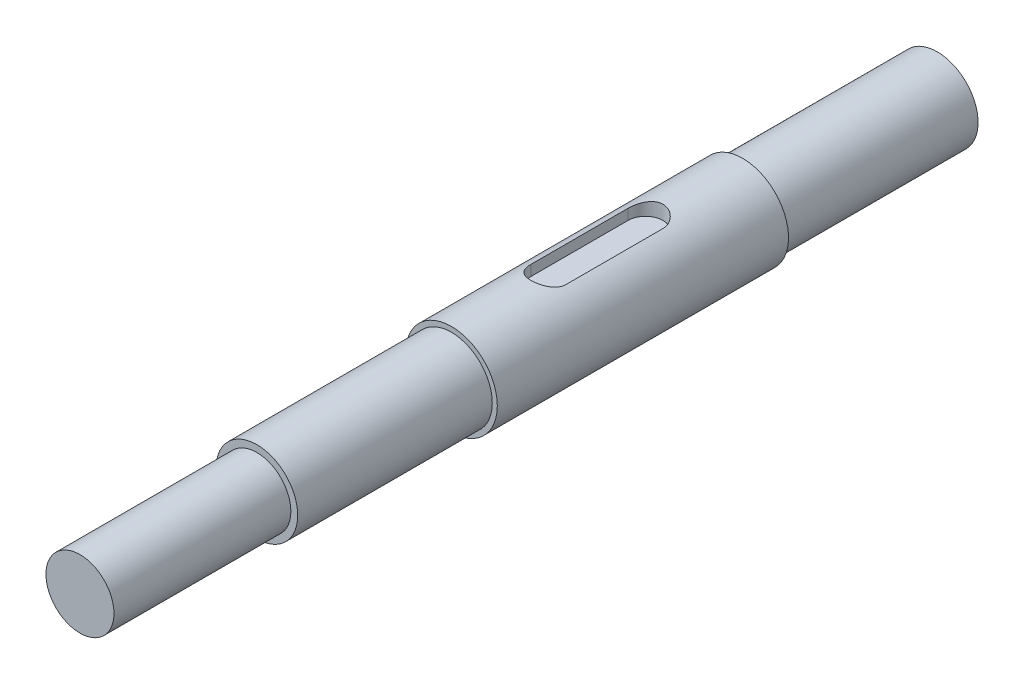
ISO-10303-21;
HEADER;
FILE_DESCRIPTION(('STEP AP214'),'2;1');
FILE_NAME('part.step','',(''),(''),'','','');
FILE_SCHEMA(('AUTOMOTIVE_DESIGN { 1 0 10303 214 1 1 1 1 }'));
ENDSEC;
DATA;
#1=APPLICATION_CONTEXT('core data for automotive mechanical design processes');
#2=APPLICATION_PROTOCOL_DEFINITION('international standard','automotive_design',2000,#1);
#3=PRODUCT_CONTEXT('',#1,'mechanical');
#4=PRODUCT('Part','Part','',(#3));
#5=PRODUCT_RELATED_PRODUCT_CATEGORY('part','',(#4));
#6=PRODUCT_DEFINITION_FORMATION('','',#4);
#7=PRODUCT_DEFINITION_CONTEXT('part definition',#1,'design');
#8=PRODUCT_DEFINITION('design','',#6,#7);
#9=PRODUCT_DEFINITION_SHAPE('','',#8);
#10=(LENGTH_UNIT() NAMED_UNIT(*) SI_UNIT(.MILLI.,.METRE.));
#11=(NAMED_UNIT(*) PLANE_ANGLE_UNIT() SI_UNIT($,.RADIAN.));
#12=(NAMED_UNIT(*) SI_UNIT($,.STERADIAN.) SOLID_ANGLE_UNIT());
#13=UNCERTAINTY_MEASURE_WITH_UNIT(LENGTH_MEASURE(1.E-05),#10,'distance_accuracy_value','');
#14=(GEOMETRIC_REPRESENTATION_CONTEXT(3) GLOBAL_UNCERTAINTY_ASSIGNED_CONTEXT((#13)) GLOBAL_UNIT_ASSIGNED_CONTEXT((#10,
#11,#12)) REPRESENTATION_CONTEXT('',''));
#15=CARTESIAN_POINT('',(0.,0.,0.));
#16=DIRECTION('',(0.,0.,1.));
#17=DIRECTION('',(1.,0.,0.));
#18=AXIS2_PLACEMENT_3D('',#15,#16,#17);
#19=CARTESIAN_POINT('',(0.,0.,49.7611294945354));
#20=DIRECTION('',(0.,0.,-1.));
#21=DIRECTION('',(-1.,0.,0.));
#22=AXIS2_PLACEMENT_3D('',#19,#20,#21);
#23=CYLINDRICAL_SURFACE('',#22,3.37);
#24=CARTESIAN_POINT('',(-1.2866946622421,3.11469370021479,28.3228707360548));
#25=CARTESIAN_POINT('',(-1.28669600319169,3.11468946310097,28.3576392006382));
#26=CARTESIAN_POINT('',(-1.28528450565034,3.11527660037109,28.3923894956666));
#27=CARTESIAN_POINT('',(-1.27966383130799,3.11759112112483,28.4616129762273));
#28=CARTESIAN_POINT('',(-1.27545562697517,3.11931810825952,28.4960862538683));
#29=CARTESIAN_POINT('',(-1.25872696519803,3.12612520784499,28.5984567833273));
#30=CARTESIAN_POINT('',(-1.24210186147237,3.13283222861704,28.6656228368802));
#31=CARTESIAN_POINT('',(-1.19855191102948,3.14974759010692,28.795926065729));
#32=CARTESIAN_POINT('',(-1.17163627710704,3.15995279816265,28.8590667859582));
#33=CARTESIAN_POINT('',(-1.10834067243159,3.18270477614191,28.9800052051234));
#34=CARTESIAN_POINT('',(-1.07195262137286,3.19525354260821,29.0377982850038));
#35=CARTESIAN_POINT('',(-0.988755061761559,3.22199566556155,29.1493148425104));
#36=CARTESIAN_POINT('',(-0.941538737437046,3.23623842269222,29.2027229135803));
#37=CARTESIAN_POINT('',(-0.83888690454215,3.26435266878082,29.3010866814295));
#38=CARTESIAN_POINT('',(-0.783449784074671,3.27822408429663,29.3460407166496));
#39=CARTESIAN_POINT('',(-0.66350605762511,3.30462658545161,29.4277650411619));
#40=CARTESIAN_POINT('',(-0.598747430153899,3.31709264443404,29.4641883327497));
#41=CARTESIAN_POINT('',(-0.463462990742811,3.33867996520791,29.5254903486761));
#42=CARTESIAN_POINT('',(-0.392939409504873,3.34780251332108,29.5503735137336));
#43=CARTESIAN_POINT('',(-0.251459302970871,3.36132267750233,29.5867719795101));
#44=CARTESIAN_POINT('',(-0.180662031067629,3.36591268223868,29.5988334286008));
#45=CARTESIAN_POINT('',(-0.0379081536596343,3.37054240025845,29.6109984655218));
#46=CARTESIAN_POINT('',(0.0340480735178751,3.37058356950806,29.6111058795339));
#47=CARTESIAN_POINT('',(0.17315218334279,3.36623175317333,29.5996723863202));
#48=CARTESIAN_POINT('',(0.240357474928526,3.36206594644942,29.5887282694671));
#49=CARTESIAN_POINT('',(0.371893264208232,3.35006851533544,29.5565094814894));
#50=CARTESIAN_POINT('',(0.43622359841726,3.34223668276603,29.5352342236969));
#51=CARTESIAN_POINT('',(0.561311094653804,3.32353600339244,29.482691513444));
#52=CARTESIAN_POINT('',(0.622001689772406,3.31262413290765,29.451281532971));
#53=CARTESIAN_POINT('',(0.73740345610198,3.28886188569313,29.3794886041575));
#54=CARTESIAN_POINT('',(0.79211262851141,3.27601086435458,29.3391026699284));
#55=CARTESIAN_POINT('',(0.897501505746436,3.24877376304033,29.2476574419362));
#56=CARTESIAN_POINT('',(0.947738617716702,3.23434184750973,29.1961010158497));
#57=CARTESIAN_POINT('',(1.03903179871,3.2061816816229,29.0852063915226));
#58=CARTESIAN_POINT('',(1.08008411813229,3.19245372040546,29.025865030785));
#59=CARTESIAN_POINT('',(1.15274089572936,3.16695612074613,28.8992622906132));
#60=CARTESIAN_POINT('',(1.18409209690208,3.15524204568629,28.8318437449344));
#61=CARTESIAN_POINT('',(1.23479202014203,3.13575148380334,28.6921529906307));
#62=CARTESIAN_POINT('',(1.2541611782796,3.127968296809,28.6198892804062));
#63=CARTESIAN_POINT('',(1.27363223312687,3.12006492778465,28.5095523007468));
#64=CARTESIAN_POINT('',(1.27852557054481,3.1180588973315,28.4724005144645));
#65=CARTESIAN_POINT('',(1.2850563359035,3.11537096270022,28.3977968016634));
#66=CARTESIAN_POINT('',(1.28669653879079,3.11468793000739,28.3603451583324));
#67=CARTESIAN_POINT('',(1.2866946622421,3.11469370021479,28.3228707360548));
#68=B_SPLINE_CURVE_WITH_KNOTS('',3,(#24,#25,#26,#27,#28,#29,#30,#31,#32,#33,#34,#35,#36,#37,#38,
#39,#40,#41,#42,#43,#44,#45,#46,#47,#48,#49,#50,#51,#52,#53,#54,#55,#56,#57,#58,#59,#60,#61,#62,
#63,#64,#65,#66,#67),.UNSPECIFIED.,.F.,.F.,(4,2,2,2,2,2,2,2,2,2,2,2,2,2,2,2,2,2,2,2,2,4),(0.,
0.10423655492761,0.208436883771406,0.415896172775477,0.62317016314475,0.830621548258879,
1.04774591382914,1.26491290860768,1.48978592189395,1.71457233057677,1.92934459153247,
2.14404810916743,2.34774629964676,2.55145605875777,2.75816557385969,2.96494395493992,
3.18420446387,3.40355432106656,3.62822350889257,3.85250844620533,3.96494160250736,
4.07727881122158),.UNSPECIFIED.);
#69=CARTESIAN_POINT('',(-1.2866946622421,3.11469370021479,28.3228707360548));
#70=VERTEX_POINT('',#69);
#71=CARTESIAN_POINT('',(1.2866946622421,3.11469370021479,28.3228707360548));
#72=VERTEX_POINT('',#71);
#73=EDGE_CURVE('E87',#70,#72,#68,.T.);
#74=ORIENTED_EDGE('',*,*,#73,.F.);
#75=DIRECTION('',(0.,0.,1.));
#76=VECTOR('',#75,1.);
#77=CARTESIAN_POINT('',(-1.2866946622421,3.11469370021479,10.9587302826353));
#78=LINE('',#77,#76);
#79=CARTESIAN_POINT('',(-1.2866946622421,3.11469370021479,21.1994187360548));
#80=VERTEX_POINT('',#79);
#81=EDGE_CURVE('E11',#80,#70,#78,.T.);
#82=ORIENTED_EDGE('',*,*,#81,.F.);
#83=CARTESIAN_POINT('',(1.2866946622421,3.11469370021479,21.1994187360548));
#84=CARTESIAN_POINT('',(1.28669600319169,3.11468946310097,21.1646502714713));
#85=CARTESIAN_POINT('',(1.28528450565034,3.11527660037109,21.129899976443));
#86=CARTESIAN_POINT('',(1.27966383130799,3.11759112112483,21.0606764958823));
#87=CARTESIAN_POINT('',(1.27545562697517,3.11931810825952,21.0262032182413));
#88=CARTESIAN_POINT('',(1.25872696519803,3.12612520784499,20.9238326887823));
#89=CARTESIAN_POINT('',(1.24210186147237,3.13283222861704,20.8566666352294));
#90=CARTESIAN_POINT('',(1.19855191102949,3.14974759010692,20.7263634063806));
#91=CARTESIAN_POINT('',(1.17163627710704,3.15995279816265,20.6632226861514));
#92=CARTESIAN_POINT('',(1.1083406724316,3.18270477614191,20.5422842669862));
#93=CARTESIAN_POINT('',(1.07195262137286,3.19525354260821,20.4844911871058));
#94=CARTESIAN_POINT('',(0.988755061761559,3.22199566556155,20.3729746295991));
#95=CARTESIAN_POINT('',(0.941538737437046,3.23623842269222,20.3195665585293));
#96=CARTESIAN_POINT('',(0.83888690454215,3.26435266878082,20.22120279068));
#97=CARTESIAN_POINT('',(0.783449784074672,3.27822408429663,20.17624875546));
#98=CARTESIAN_POINT('',(0.663506057625113,3.30462658545161,20.0945244309477));
#99=CARTESIAN_POINT('',(0.598747430153902,3.31709264443404,20.0581011393599));
#100=CARTESIAN_POINT('',(0.463462990742815,3.33867996520791,19.9967991234335));
#101=CARTESIAN_POINT('',(0.392939409504877,3.34780251332108,19.971915958376));
#102=CARTESIAN_POINT('',(0.251459302970874,3.36132267750233,19.9355174925994));
#103=CARTESIAN_POINT('',(0.180662031067632,3.36591268223868,19.9234560435088));
#104=CARTESIAN_POINT('',(0.0379081536596375,3.37054240025845,19.9112910065878));
#105=CARTESIAN_POINT('',(-0.0340480735178722,3.37058356950806,19.9111835925757));
#106=CARTESIAN_POINT('',(-0.173152183342787,3.36623175317333,19.9226170857894));
#107=CARTESIAN_POINT('',(-0.240357474928522,3.36206594644942,19.9335612026425));
#108=CARTESIAN_POINT('',(-0.371893264208228,3.35006851533544,19.9657799906202));
#109=CARTESIAN_POINT('',(-0.436223598417257,3.34223668276603,19.9870552484126));
#110=CARTESIAN_POINT('',(-0.561311094653802,3.32353600339244,20.0395979586656));
#111=CARTESIAN_POINT('',(-0.622001689772404,3.31262413290765,20.0710079391386));
#112=CARTESIAN_POINT('',(-0.737403456101978,3.28886188569313,20.1428008679521));
#113=CARTESIAN_POINT('',(-0.792112628511407,3.27601086435458,20.1831868021812));
#114=CARTESIAN_POINT('',(-0.897501505746433,3.24877376304033,20.2746320301734));
#115=CARTESIAN_POINT('',(-0.947738617716699,3.23434184750973,20.3261884562599));
#116=CARTESIAN_POINT('',(-1.03903179871,3.2061816816229,20.4370830805869));
#117=CARTESIAN_POINT('',(-1.08008411813229,3.19245372040547,20.4964244413246));
#118=CARTESIAN_POINT('',(-1.15274089572936,3.16695612074613,20.6230271814963));
#119=CARTESIAN_POINT('',(-1.18409209690208,3.15524204568629,20.6904457271752));
#120=CARTESIAN_POINT('',(-1.23479202014203,3.13575148380334,20.8301364814789));
#121=CARTESIAN_POINT('',(-1.2541611782796,3.127968296809,20.9024001917034));
#122=CARTESIAN_POINT('',(-1.27363223312687,3.12006492778465,21.0127371713627));
#123=CARTESIAN_POINT('',(-1.27852557054481,3.1180588973315,21.0498889576451));
#124=CARTESIAN_POINT('',(-1.2850563359035,3.11537096270022,21.1244926704462));
#125=CARTESIAN_POINT('',(-1.2866965387908,3.11468793000739,21.1619443137772));
#126=CARTESIAN_POINT('',(-1.2866946622421,3.11469370021479,21.1994187360548));
#127=B_SPLINE_CURVE_WITH_KNOTS('',3,(#83,#84,#85,#86,#87,#88,#89,#90,#91,#92,#93,#94,#95,#96,
#97,#98,#99,#100,#101,#102,#103,#104,#105,#106,#107,#108,#109,#110,#111,#112,#113,#114,#115,
#116,#117,#118,#119,#120,#121,#122,#123,#124,#125,#126),.UNSPECIFIED.,.F.,.F.,(4,2,2,2,2,2,2,2,
2,2,2,2,2,2,2,2,2,2,2,2,2,4),(0.,0.10423655492761,0.208436883771406,0.415896172775477,
0.623170163144749,0.830621548258882,1.04774591382915,1.26491290860768,1.48978592189396,
1.71457233057677,1.92934459153247,2.14404810916743,2.34774629964677,2.55145605875777,
2.75816557385969,2.96494395493992,3.18420446387,3.40355432106656,3.62822350889257,
3.85250844620534,3.96494160250737,4.07727881122159),.UNSPECIFIED.);
#128=CARTESIAN_POINT('',(1.2866946622421,3.11469370021479,21.1994187360548));
#129=VERTEX_POINT('',#128);
#130=EDGE_CURVE('E118',#129,#80,#127,.T.);
#131=ORIENTED_EDGE('',*,*,#130,.F.);
#132=DIRECTION('',(0.,0.,1.));
#133=VECTOR('',#132,1.);
#134=CARTESIAN_POINT('',(1.2866946622421,3.11469370021479,10.9587302826353));
#135=LINE('',#134,#133);
#136=EDGE_CURVE('E51',#129,#72,#135,.T.);
#137=ORIENTED_EDGE('',*,*,#136,.T.);
#138=EDGE_LOOP('',(#74,#82,#131,#137));
#139=FACE_BOUND('',#138,.T.);
#140=CARTESIAN_POINT('',(0.,0.,35.4611294945354));
#141=DIRECTION('',(0.,0.,1.));
#142=DIRECTION('',(1.,0.,0.));
#143=AXIS2_PLACEMENT_3D('',#140,#141,#142);
#144=CIRCLE('',#143,3.37);
#145=CARTESIAN_POINT('',(3.37,0.,35.4611294945354));
#146=VERTEX_POINT('',#145);
#147=EDGE_CURVE('E191',#146,#146,#144,.T.);
#148=ORIENTED_EDGE('',*,*,#147,.F.);
#149=EDGE_LOOP('',(#148));
#150=FACE_BOUND('',#149,.T.);
#151=CARTESIAN_POINT('',(0.,0.,14.0611294945354));
#152=DIRECTION('',(0.,0.,-1.));
#153=DIRECTION('',(-1.,0.,0.));
#154=AXIS2_PLACEMENT_3D('',#151,#152,#153);
#155=CIRCLE('',#154,3.37);
#156=CARTESIAN_POINT('',(-3.37,0.,14.0611294945354));
#157=VERTEX_POINT('',#156);
#158=EDGE_CURVE('E194',#157,#157,#155,.T.);
#159=ORIENTED_EDGE('',*,*,#158,.F.);
#160=EDGE_LOOP('',(#159));
#161=FACE_BOUND('',#160,.T.);
#162=ADVANCED_FACE('F42',(#139,#150,#161),#23,.T.);
#163=CARTESIAN_POINT('',(0.,0.,35.4611294945354));
#164=DIRECTION('',(0.,0.,1.));
#165=DIRECTION('',(1.,0.,0.));
#166=AXIS2_PLACEMENT_3D('',#163,#164,#165);
#167=PLANE('',#166);
#168=CARTESIAN_POINT('',(0.,0.,35.4611294945354));
#169=DIRECTION('',(0.,0.,1.));
#170=DIRECTION('',(1.,0.,0.));
#171=AXIS2_PLACEMENT_3D('',#168,#169,#170);
#172=CIRCLE('',#171,3.);
#173=CARTESIAN_POINT('',(3.,0.,35.4611294945354));
#174=VERTEX_POINT('',#173);
#175=EDGE_CURVE('E204',#174,#174,#172,.T.);
#176=ORIENTED_EDGE('',*,*,#175,.F.);
#177=EDGE_LOOP('',(#176));
#178=FACE_BOUND('',#177,.T.);
#179=ORIENTED_EDGE('',*,*,#147,.T.);
#180=EDGE_LOOP('',(#179));
#181=FACE_BOUND('',#180,.T.);
#182=ADVANCED_FACE('F163',(#178,#181),#167,.T.);
#183=CARTESIAN_POINT('',(0.,0.,35.4611294945354));
#184=DIRECTION('',(0.,0.,1.));
#185=DIRECTION('',(1.,0.,0.));
#186=AXIS2_PLACEMENT_3D('',#183,#184,#185);
#187=CYLINDRICAL_SURFACE('',#186,3.);
#188=ORIENTED_EDGE('',*,*,#175,.T.);
#189=EDGE_LOOP('',(#188));
#190=FACE_BOUND('',#189,.T.);
#191=CARTESIAN_POINT('',(0.,0.,49.7611294945354));
#192=DIRECTION('',(0.,0.,1.));
#193=DIRECTION('',(1.,0.,0.));
#194=AXIS2_PLACEMENT_3D('',#191,#192,#193);
#195=CIRCLE('',#194,3.);
#196=CARTESIAN_POINT('',(3.,0.,49.7611294945354));
#197=VERTEX_POINT('',#196);
#198=EDGE_CURVE('E197',#197,#197,#195,.T.);
#199=ORIENTED_EDGE('',*,*,#198,.F.);
#200=EDGE_LOOP('',(#199));
#201=FACE_BOUND('',#200,.T.);
#202=ADVANCED_FACE('F159',(#190,#201),#187,.T.);
#203=CARTESIAN_POINT('',(0.,0.,62.7611294945354));
#204=DIRECTION('',(0.,0.,1.));
#205=DIRECTION('',(1.,0.,0.));
#206=AXIS2_PLACEMENT_3D('',#203,#204,#205);
#207=PLANE('',#206);
#208=CARTESIAN_POINT('',(0.,0.,62.7611294945354));
#209=DIRECTION('',(0.,0.,1.));
#210=DIRECTION('',(1.,0.,0.));
#211=AXIS2_PLACEMENT_3D('',#208,#209,#210);
#212=CIRCLE('',#211,2.5);
#213=CARTESIAN_POINT('',(2.5,0.,62.7611294945354));
#214=VERTEX_POINT('',#213);
#215=EDGE_CURVE('E214',#214,#214,#212,.T.);
#216=ORIENTED_EDGE('',*,*,#215,.T.);
#217=EDGE_LOOP('',(#216));
#218=FACE_BOUND('',#217,.T.);
#219=ADVANCED_FACE('F162',(#218),#207,.T.);
#220=CARTESIAN_POINT('',(0.,0.,49.7611294945354));
#221=DIRECTION('',(0.,0.,1.));
#222=DIRECTION('',(1.,0.,0.));
#223=AXIS2_PLACEMENT_3D('',#220,#221,#222);
#224=CYLINDRICAL_SURFACE('',#223,2.5);
#225=CARTESIAN_POINT('',(0.,0.,49.7611294945354));
#226=DIRECTION('',(0.,0.,1.));
#227=DIRECTION('',(1.,0.,0.));
#228=AXIS2_PLACEMENT_3D('',#225,#226,#227);
#229=CIRCLE('',#228,2.5);
#230=CARTESIAN_POINT('',(2.5,0.,49.7611294945354));
#231=VERTEX_POINT('',#230);
#232=EDGE_CURVE('E215',#231,#231,#229,.T.);
#233=CARTESIAN_POINT('',(2.5,0.,49.7611294945354));
#234=CARTESIAN_POINT('',(2.5,0.,49.8965461612021));
#235=CARTESIAN_POINT('',(2.5,0.,50.0319628278687));
#236=CARTESIAN_POINT('',(2.5,0.,50.3027961612021));
#237=CARTESIAN_POINT('',(2.5,0.,50.4382128278687));
#238=CARTESIAN_POINT('',(2.5,0.,50.7090461612021));
#239=CARTESIAN_POINT('',(2.5,0.,50.8444628278687));
#240=CARTESIAN_POINT('',(2.5,0.,51.1152961612021));
#241=CARTESIAN_POINT('',(2.5,0.,51.2507128278687));
#242=CARTESIAN_POINT('',(2.5,0.,51.5215461612021));
#243=CARTESIAN_POINT('',(2.5,0.,51.6569628278687));
#244=CARTESIAN_POINT('',(2.5,0.,51.9277961612021));
#245=CARTESIAN_POINT('',(2.5,0.,52.0632128278687));
#246=CARTESIAN_POINT('',(2.5,0.,52.3340461612021));
#247=CARTESIAN_POINT('',(2.5,0.,52.4694628278687));
#248=CARTESIAN_POINT('',(2.5,0.,52.7402961612021));
#249=CARTESIAN_POINT('',(2.5,0.,52.8757128278687));
#250=CARTESIAN_POINT('',(2.5,0.,53.1465461612021));
#251=CARTESIAN_POINT('',(2.5,0.,53.2819628278687));
#252=CARTESIAN_POINT('',(2.5,0.,53.5527961612021));
#253=CARTESIAN_POINT('',(2.5,0.,53.6882128278687));
#254=CARTESIAN_POINT('',(2.5,0.,53.9590461612021));
#255=CARTESIAN_POINT('',(2.5,0.,54.0944628278687));
#256=CARTESIAN_POINT('',(2.5,0.,54.3652961612021));
#257=CARTESIAN_POINT('',(2.5,0.,54.5007128278687));
#258=CARTESIAN_POINT('',(2.5,0.,54.7715461612021));
#259=CARTESIAN_POINT('',(2.5,0.,54.9069628278687));
#260=CARTESIAN_POINT('',(2.5,0.,55.1777961612021));
#261=CARTESIAN_POINT('',(2.5,0.,55.3132128278687));
#262=CARTESIAN_POINT('',(2.5,0.,55.5840461612021));
#263=CARTESIAN_POINT('',(2.5,0.,55.7194628278687));
#264=CARTESIAN_POINT('',(2.5,0.,55.9902961612021));
#265=CARTESIAN_POINT('',(2.5,0.,56.1257128278687));
#266=CARTESIAN_POINT('',(2.5,0.,56.3965461612021));
#267=CARTESIAN_POINT('',(2.5,0.,56.5319628278687));
#268=CARTESIAN_POINT('',(2.5,0.,56.8027961612021));
#269=CARTESIAN_POINT('',(2.5,0.,56.9382128278687));
#270=CARTESIAN_POINT('',(2.5,0.,57.2090461612021));
#271=CARTESIAN_POINT('',(2.5,0.,57.3444628278687));
#272=CARTESIAN_POINT('',(2.5,0.,57.6152961612021));
#273=CARTESIAN_POINT('',(2.5,0.,57.7507128278687));
#274=CARTESIAN_POINT('',(2.5,0.,58.0215461612021));
#275=CARTESIAN_POINT('',(2.5,0.,58.1569628278687));
#276=CARTESIAN_POINT('',(2.5,0.,58.4277961612021));
#277=CARTESIAN_POINT('',(2.5,0.,58.5632128278687));
#278=CARTESIAN_POINT('',(2.5,0.,58.8340461612021));
#279=CARTESIAN_POINT('',(2.5,0.,58.9694628278687));
#280=CARTESIAN_POINT('',(2.5,0.,59.2402961612021));
#281=CARTESIAN_POINT('',(2.5,0.,59.3757128278687));
#282=CARTESIAN_POINT('',(2.5,0.,59.6465461612021));
#283=CARTESIAN_POINT('',(2.5,0.,59.7819628278687));
#284=CARTESIAN_POINT('',(2.5,0.,60.0527961612021));
#285=CARTESIAN_POINT('',(2.5,0.,60.1882128278687));
#286=CARTESIAN_POINT('',(2.5,0.,60.4590461612021));
#287=CARTESIAN_POINT('',(2.5,0.,60.5944628278687));
#288=CARTESIAN_POINT('',(2.5,0.,60.8652961612021));
#289=CARTESIAN_POINT('',(2.5,0.,61.0007128278687));
#290=CARTESIAN_POINT('',(2.5,0.,61.2715461612021));
#291=CARTESIAN_POINT('',(2.5,0.,61.4069628278687));
#292=CARTESIAN_POINT('',(2.5,0.,61.6777961612021));
#293=CARTESIAN_POINT('',(2.5,0.,61.8132128278687));
#294=CARTESIAN_POINT('',(2.5,0.,62.0840461612021));
#295=CARTESIAN_POINT('',(2.5,0.,62.2194628278687));
#296=CARTESIAN_POINT('',(2.5,0.,62.4902961612021));
#297=CARTESIAN_POINT('',(2.5,0.,62.6257128278687));
#298=CARTESIAN_POINT('',(2.5,0.,62.7611294945354));
#299=B_SPLINE_CURVE_WITH_KNOTS('',3,(#233,#234,#235,#236,#237,#238,#239,#240,#241,#242,#243,
#244,#245,#246,#247,#248,#249,#250,#251,#252,#253,#254,#255,#256,#257,#258,#259,#260,#261,#262,
#263,#264,#265,#266,#267,#268,#269,#270,#271,#272,#273,#274,#275,#276,#277,#278,#279,#280,#281,
#282,#283,#284,#285,#286,#287,#288,#289,#290,#291,#292,#293,#294,#295,#296,#297,#298),
.UNSPECIFIED.,.F.,.F.,(4,2,2,2,2,2,2,2,2,2,2,2,2,2,2,2,2,2,2,2,2,2,2,2,2,2,2,2,2,2,2,2,4),(0.,
0.406249999999997,0.812499999999994,1.21875,1.62499999999999,2.03125,2.4375,2.84374999999999,
3.25,3.65624999999999,4.0625,4.46874999999999,4.87499999999999,5.28124999999999,
5.68749999999999,6.09374999999999,6.49999999999999,6.90624999999999,7.31249999999999,
7.71874999999999,8.12499999999999,8.53124999999999,8.93749999999999,9.34374999999999,
9.74999999999999,10.15625,10.5625,10.96875,11.375,11.78125,12.1875,12.59375,13.),.UNSPECIFIED.);
#300=EDGE_CURVE('BSEAM168',#231,#214,#299,.T.);
#301=ORIENTED_EDGE('',*,*,#232,.T.);
#302=ORIENTED_EDGE('',*,*,#215,.F.);
#303=ORIENTED_EDGE('',*,*,#300,.T.);
#304=ORIENTED_EDGE('',*,*,#300,.F.);
#305=EDGE_LOOP('',(#301,#303,#302,#304));
#306=FACE_BOUND('',#305,.T.);
#307=ADVANCED_FACE('F168',(#306),#224,.T.);
#308=CARTESIAN_POINT('',(0.,0.,49.7611294945354));
#309=DIRECTION('',(0.,0.,1.));
#310=DIRECTION('',(1.,0.,0.));
#311=AXIS2_PLACEMENT_3D('',#308,#309,#310);
#312=PLANE('',#311);
#313=ORIENTED_EDGE('',*,*,#232,.F.);
#314=EDGE_LOOP('',(#313));
#315=FACE_BOUND('',#314,.T.);
#316=ORIENTED_EDGE('',*,*,#198,.T.);
#317=EDGE_LOOP('',(#316));
#318=FACE_BOUND('',#317,.T.);
#319=ADVANCED_FACE('F157',(#315,#318),#312,.T.);
#320=CARTESIAN_POINT('',(0.,0.,14.0611294945354));
#321=DIRECTION('',(0.,0.,-1.));
#322=DIRECTION('',(-1.,0.,0.));
#323=AXIS2_PLACEMENT_3D('',#320,#321,#322);
#324=PLANE('',#323);
#325=CARTESIAN_POINT('',(0.,0.,14.0611294945354));
#326=DIRECTION('',(0.,0.,-1.));
#327=DIRECTION('',(-1.,0.,0.));
#328=AXIS2_PLACEMENT_3D('',#325,#326,#327);
#329=CIRCLE('',#328,3.);
#330=CARTESIAN_POINT('',(-3.,0.,14.0611294945354));
#331=VERTEX_POINT('',#330);
#332=EDGE_CURVE('E198',#331,#331,#329,.T.);
#333=ORIENTED_EDGE('',*,*,#332,.F.);
#334=EDGE_LOOP('',(#333));
#335=FACE_BOUND('',#334,.T.);
#336=ORIENTED_EDGE('',*,*,#158,.T.);
#337=EDGE_LOOP('',(#336));
#338=FACE_BOUND('',#337,.T.);
#339=ADVANCED_FACE('F153',(#335,#338),#324,.T.);
#340=CARTESIAN_POINT('',(0.,0.,14.0611294945354));
#341=DIRECTION('',(0.,0.,-1.));
#342=DIRECTION('',(-1.,0.,0.));
#343=AXIS2_PLACEMENT_3D('',#340,#341,#342);
#344=CYLINDRICAL_SURFACE('',#343,3.);
#345=ORIENTED_EDGE('',*,*,#332,.T.);
#346=EDGE_LOOP('',(#345));
#347=FACE_BOUND('',#346,.T.);
#348=CARTESIAN_POINT('',(0.,0.,-0.238870505464586));
#349=DIRECTION('',(0.,0.,-1.));
#350=DIRECTION('',(-1.,0.,0.));
#351=AXIS2_PLACEMENT_3D('',#348,#349,#350);
#352=CIRCLE('',#351,3.);
#353=CARTESIAN_POINT('',(-3.,0.,-0.238870505464585));
#354=VERTEX_POINT('',#353);
#355=EDGE_CURVE('E207',#354,#354,#352,.T.);
#356=ORIENTED_EDGE('',*,*,#355,.F.);
#357=EDGE_LOOP('',(#356));
#358=FACE_BOUND('',#357,.T.);
#359=ADVANCED_FACE('F150',(#347,#358),#344,.T.);
#360=CARTESIAN_POINT('',(0.,0.,-0.238870505464586));
#361=DIRECTION('',(0.,0.,-1.));
#362=DIRECTION('',(-1.,0.,0.));
#363=AXIS2_PLACEMENT_3D('',#360,#361,#362);
#364=PLANE('',#363);
#365=ORIENTED_EDGE('',*,*,#355,.T.);
#366=EDGE_LOOP('',(#365));
#367=FACE_BOUND('',#366,.T.);
#368=ADVANCED_FACE('F149',(#367),#364,.T.);
#369=CARTESIAN_POINT('',(0.,2.34,28.3228707360548));
#370=DIRECTION('',(0.,1.,0.));
#371=DIRECTION('',(0.,0.,1.));
#372=AXIS2_PLACEMENT_3D('',#369,#370,#371);
#373=CYLINDRICAL_SURFACE('',#372,1.2866946622421);
#374=ORIENTED_EDGE('',*,*,#73,.T.);
#375=DIRECTION('',(0.,1.,0.));
#376=VECTOR('',#375,1.);
#377=CARTESIAN_POINT('',(1.2866946622421,2.34,28.3228707360548));
#378=LINE('',#377,#376);
#379=CARTESIAN_POINT('',(1.2866946622421,2.34,28.3228707360548));
#380=VERTEX_POINT('',#379);
#381=EDGE_CURVE('E58',#380,#72,#378,.T.);
#382=ORIENTED_EDGE('',*,*,#381,.F.);
#383=CARTESIAN_POINT('',(0.,2.34,28.3228707360548));
#384=DIRECTION('',(0.,1.,0.));
#385=DIRECTION('',(0.,0.,1.));
#386=AXIS2_PLACEMENT_3D('',#383,#384,#385);
#387=CIRCLE('',#386,1.2866946622421);
#388=CARTESIAN_POINT('',(-1.2866946622421,2.34,28.3228707360548));
#389=VERTEX_POINT('',#388);
#390=EDGE_CURVE('E84',#389,#380,#387,.T.);
#391=ORIENTED_EDGE('',*,*,#390,.F.);
#392=DIRECTION('',(0.,1.,0.));
#393=VECTOR('',#392,1.);
#394=CARTESIAN_POINT('',(-1.2866946622421,2.34,28.3228707360548));
#395=LINE('',#394,#393);
#396=EDGE_CURVE('E115',#389,#70,#395,.T.);
#397=ORIENTED_EDGE('',*,*,#396,.T.);
#398=EDGE_LOOP('',(#374,#382,#391,#397));
#399=FACE_BOUND('',#398,.T.);
#400=ADVANCED_FACE('F82',(#399),#373,.F.);
#401=CARTESIAN_POINT('',(-1.2866946622421,2.34,28.3228707360548));
#402=DIRECTION('',(-1.,0.,0.));
#403=DIRECTION('',(0.,0.,1.));
#404=AXIS2_PLACEMENT_3D('',#401,#402,#403);
#405=PLANE('',#404);
#406=ORIENTED_EDGE('',*,*,#81,.T.);
#407=ORIENTED_EDGE('',*,*,#396,.F.);
#408=DIRECTION('',(0.,0.,1.));
#409=VECTOR('',#408,1.);
#410=CARTESIAN_POINT('',(-1.2866946622421,2.34,28.3228707360548));
#411=LINE('',#410,#409);
#412=CARTESIAN_POINT('',(-1.2866946622421,2.34,21.1994187360548));
#413=VERTEX_POINT('',#412);
#414=EDGE_CURVE('E91',#413,#389,#411,.T.);
#415=ORIENTED_EDGE('',*,*,#414,.F.);
#416=DIRECTION('',(0.,1.,0.));
#417=VECTOR('',#416,1.);
#418=CARTESIAN_POINT('',(-1.2866946622421,2.34,21.1994187360548));
#419=LINE('',#418,#417);
#420=EDGE_CURVE('E119',#413,#80,#419,.T.);
#421=ORIENTED_EDGE('',*,*,#420,.T.);
#422=EDGE_LOOP('',(#406,#407,#415,#421));
#423=FACE_BOUND('',#422,.T.);
#424=ADVANCED_FACE('F142',(#423),#405,.F.);
#425=CARTESIAN_POINT('',(0.,2.34,21.1994187360548));
#426=DIRECTION('',(0.,1.,0.));
#427=DIRECTION('',(0.,0.,1.));
#428=AXIS2_PLACEMENT_3D('',#425,#426,#427);
#429=CYLINDRICAL_SURFACE('',#428,1.2866946622421);
#430=ORIENTED_EDGE('',*,*,#130,.T.);
#431=ORIENTED_EDGE('',*,*,#420,.F.);
#432=CARTESIAN_POINT('',(0.,2.34,21.1994187360548));
#433=DIRECTION('',(0.,1.,0.));
#434=DIRECTION('',(0.,0.,1.));
#435=AXIS2_PLACEMENT_3D('',#432,#433,#434);
#436=CIRCLE('',#435,1.2866946622421);
#437=CARTESIAN_POINT('',(1.2866946622421,2.34,21.1994187360548));
#438=VERTEX_POINT('',#437);
#439=EDGE_CURVE('E101',#438,#413,#436,.T.);
#440=ORIENTED_EDGE('',*,*,#439,.F.);
#441=DIRECTION('',(0.,1.,0.));
#442=VECTOR('',#441,1.);
#443=CARTESIAN_POINT('',(1.2866946622421,2.34,21.1994187360548));
#444=LINE('',#443,#442);
#445=EDGE_CURVE('E90',#438,#129,#444,.T.);
#446=ORIENTED_EDGE('',*,*,#445,.T.);
#447=EDGE_LOOP('',(#430,#431,#440,#446));
#448=FACE_BOUND('',#447,.T.);
#449=ADVANCED_FACE('F137',(#448),#429,.F.);
#450=CARTESIAN_POINT('',(1.2866946622421,2.34,28.3228707360548));
#451=DIRECTION('',(1.,0.,0.));
#452=DIRECTION('',(0.,0.,-1.));
#453=AXIS2_PLACEMENT_3D('',#450,#451,#452);
#454=PLANE('',#453);
#455=ORIENTED_EDGE('',*,*,#136,.F.);
#456=ORIENTED_EDGE('',*,*,#445,.F.);
#457=DIRECTION('',(0.,0.,-1.));
#458=VECTOR('',#457,1.);
#459=CARTESIAN_POINT('',(1.2866946622421,2.34,28.3228707360548));
#460=LINE('',#459,#458);
#461=EDGE_CURVE('E94',#380,#438,#460,.T.);
#462=ORIENTED_EDGE('',*,*,#461,.F.);
#463=ORIENTED_EDGE('',*,*,#381,.T.);
#464=EDGE_LOOP('',(#455,#456,#462,#463));
#465=FACE_BOUND('',#464,.T.);
#466=ADVANCED_FACE('F95',(#465),#454,.F.);
#467=CARTESIAN_POINT('',(0.,2.34,28.3228707360548));
#468=DIRECTION('',(0.,1.,0.));
#469=DIRECTION('',(0.,0.,1.));
#470=AXIS2_PLACEMENT_3D('',#467,#468,#469);
#471=PLANE('',#470);
#472=ORIENTED_EDGE('',*,*,#390,.T.);
#473=ORIENTED_EDGE('',*,*,#461,.T.);
#474=ORIENTED_EDGE('',*,*,#439,.T.);
#475=ORIENTED_EDGE('',*,*,#414,.T.);
#476=EDGE_LOOP('',(#472,#473,#474,#475));
#477=FACE_BOUND('',#476,.T.);
#478=ADVANCED_FACE('F103',(#477),#471,.T.);
#479=CLOSED_SHELL('',(#162,#182,#202,#219,#307,#319,#339,#359,#368,#400,#424,#449,#466,#478));
#480=MANIFOLD_SOLID_BREP('B2',#479);
#481=ADVANCED_BREP_SHAPE_REPRESENTATION('',(#18,#480),#14);
#482=SHAPE_DEFINITION_REPRESENTATION(#9,#481);
ENDSEC;
END-ISO-10303-21;
